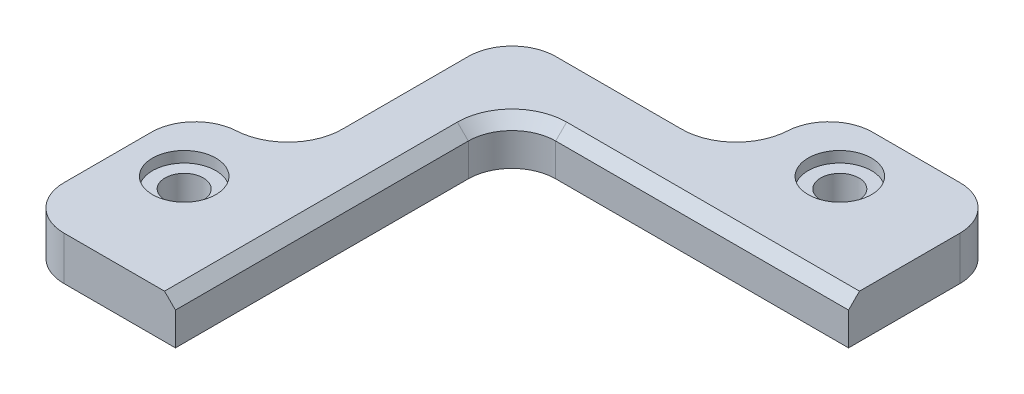
ISO-10303-21;
HEADER;
FILE_DESCRIPTION(('STEP AP214'),'2;1');
FILE_NAME('part.step','',(''),(''),'','','');
FILE_SCHEMA(('AUTOMOTIVE_DESIGN { 1 0 10303 214 1 1 1 1 }'));
ENDSEC;
DATA;
#1=APPLICATION_CONTEXT('core data for automotive mechanical design processes');
#2=APPLICATION_PROTOCOL_DEFINITION('international standard','automotive_design',2000,#1);
#3=PRODUCT_CONTEXT('',#1,'mechanical');
#4=PRODUCT('Part','Part','',(#3));
#5=PRODUCT_RELATED_PRODUCT_CATEGORY('part','',(#4));
#6=PRODUCT_DEFINITION_FORMATION('','',#4);
#7=PRODUCT_DEFINITION_CONTEXT('part definition',#1,'design');
#8=PRODUCT_DEFINITION('design','',#6,#7);
#9=PRODUCT_DEFINITION_SHAPE('','',#8);
#10=(LENGTH_UNIT() NAMED_UNIT(*) SI_UNIT(.MILLI.,.METRE.));
#11=(NAMED_UNIT(*) PLANE_ANGLE_UNIT() SI_UNIT($,.RADIAN.));
#12=(NAMED_UNIT(*) SI_UNIT($,.STERADIAN.) SOLID_ANGLE_UNIT());
#13=UNCERTAINTY_MEASURE_WITH_UNIT(LENGTH_MEASURE(1.E-05),#10,'distance_accuracy_value','');
#14=(GEOMETRIC_REPRESENTATION_CONTEXT(3) GLOBAL_UNCERTAINTY_ASSIGNED_CONTEXT((#13)) GLOBAL_UNIT_ASSIGNED_CONTEXT((#10,
#11,#12)) REPRESENTATION_CONTEXT('',''));
#15=CARTESIAN_POINT('',(0.,0.,0.));
#16=DIRECTION('',(0.,0.,1.));
#17=DIRECTION('',(1.,0.,0.));
#18=AXIS2_PLACEMENT_3D('',#15,#16,#17);
#19=CARTESIAN_POINT('',(35.,4.,-40.));
#20=DIRECTION('',(0.,-1.,0.));
#21=DIRECTION('',(0.,0.,-1.));
#22=AXIS2_PLACEMENT_3D('',#19,#20,#21);
#23=CYLINDRICAL_SURFACE('',#22,1.75);
#24=CARTESIAN_POINT('',(35.,0.,-40.));
#25=DIRECTION('',(0.,1.,0.));
#26=DIRECTION('',(0.,0.,1.));
#27=AXIS2_PLACEMENT_3D('',#24,#25,#26);
#28=CIRCLE('',#27,1.75);
#29=CARTESIAN_POINT('',(35.,0.,-38.25));
#30=VERTEX_POINT('',#29);
#31=EDGE_CURVE('E172',#30,#30,#28,.T.);
#32=ORIENTED_EDGE('',*,*,#31,.F.);
#33=EDGE_LOOP('',(#32));
#34=FACE_BOUND('',#33,.T.);
#35=CARTESIAN_POINT('',(35.,3.,-40.));
#36=DIRECTION('',(0.,1.,0.));
#37=DIRECTION('',(0.,0.,1.));
#38=AXIS2_PLACEMENT_3D('',#35,#36,#37);
#39=CIRCLE('',#38,1.75);
#40=CARTESIAN_POINT('',(35.,3.,-38.25));
#41=VERTEX_POINT('',#40);
#42=EDGE_CURVE('E288',#41,#41,#39,.T.);
#43=ORIENTED_EDGE('',*,*,#42,.T.);
#44=EDGE_LOOP('',(#43));
#45=FACE_BOUND('',#44,.T.);
#46=ADVANCED_FACE('F35',(#34,#45),#23,.F.);
#47=CARTESIAN_POINT('',(5.,4.,-9.99999999999999));
#48=DIRECTION('',(0.,-1.,0.));
#49=DIRECTION('',(0.,0.,-1.));
#50=AXIS2_PLACEMENT_3D('',#47,#48,#49);
#51=CYLINDRICAL_SURFACE('',#50,1.75);
#52=CARTESIAN_POINT('',(5.,0.,-9.99999999999999));
#53=DIRECTION('',(0.,1.,0.));
#54=DIRECTION('',(0.,0.,1.));
#55=AXIS2_PLACEMENT_3D('',#52,#53,#54);
#56=CIRCLE('',#55,1.75);
#57=CARTESIAN_POINT('',(5.,0.,-8.24999999999999));
#58=VERTEX_POINT('',#57);
#59=EDGE_CURVE('E198',#58,#58,#56,.T.);
#60=ORIENTED_EDGE('',*,*,#59,.F.);
#61=EDGE_LOOP('',(#60));
#62=FACE_BOUND('',#61,.T.);
#63=CARTESIAN_POINT('',(5.,3.,-9.99999999999999));
#64=DIRECTION('',(0.,1.,0.));
#65=DIRECTION('',(0.,0.,1.));
#66=AXIS2_PLACEMENT_3D('',#63,#64,#65);
#67=CIRCLE('',#66,1.75);
#68=CARTESIAN_POINT('',(5.,3.,-8.24999999999999));
#69=VERTEX_POINT('',#68);
#70=EDGE_CURVE('E291',#69,#69,#67,.T.);
#71=ORIENTED_EDGE('',*,*,#70,.T.);
#72=EDGE_LOOP('',(#71));
#73=FACE_BOUND('',#72,.T.);
#74=ADVANCED_FACE('F383',(#62,#73),#51,.F.);
#75=CARTESIAN_POINT('',(0.,4.,-45.));
#76=DIRECTION('',(0.,0.,1.));
#77=DIRECTION('',(1.,0.,0.));
#78=AXIS2_PLACEMENT_3D('',#75,#76,#77);
#79=PLANE('',#78);
#80=DIRECTION('',(-1.,0.,0.));
#81=VECTOR('',#80,1.);
#82=CARTESIAN_POINT('',(0.,0.,-45.));
#83=LINE('',#82,#81);
#84=CARTESIAN_POINT('',(41.,0.,-45.));
#85=VERTEX_POINT('',#84);
#86=CARTESIAN_POINT('',(33.,0.,-45.));
#87=VERTEX_POINT('',#86);
#88=EDGE_CURVE('E219',#85,#87,#83,.T.);
#89=ORIENTED_EDGE('',*,*,#88,.T.);
#90=DIRECTION('',(0.,1.,0.));
#91=VECTOR('',#90,1.);
#92=CARTESIAN_POINT('',(33.,4.,-45.));
#93=LINE('',#92,#91);
#94=CARTESIAN_POINT('',(33.,4.,-45.));
#95=VERTEX_POINT('',#94);
#96=EDGE_CURVE('E262',#87,#95,#93,.T.);
#97=ORIENTED_EDGE('',*,*,#96,.T.);
#98=DIRECTION('',(-1.,0.,0.));
#99=VECTOR('',#98,1.);
#100=CARTESIAN_POINT('',(0.,4.,-45.));
#101=LINE('',#100,#99);
#102=CARTESIAN_POINT('',(41.,4.,-45.));
#103=VERTEX_POINT('',#102);
#104=EDGE_CURVE('E210',#103,#95,#101,.T.);
#105=ORIENTED_EDGE('',*,*,#104,.F.);
#106=DIRECTION('',(0.,-1.,0.));
#107=VECTOR('',#106,1.);
#108=CARTESIAN_POINT('',(41.,4.,-45.));
#109=LINE('',#108,#107);
#110=EDGE_CURVE('E259',#103,#85,#109,.T.);
#111=ORIENTED_EDGE('',*,*,#110,.T.);
#112=EDGE_LOOP('',(#89,#97,#105,#111));
#113=FACE_BOUND('',#112,.T.);
#114=ADVANCED_FACE('F368',(#113),#79,.F.);
#115=CARTESIAN_POINT('',(0.,4.,0.));
#116=DIRECTION('',(0.,-1.,0.));
#117=DIRECTION('',(0.,0.,-1.));
#118=AXIS2_PLACEMENT_3D('',#115,#116,#117);
#119=PLANE('',#118);
#120=CARTESIAN_POINT('',(35.,4.,-40.));
#121=DIRECTION('',(0.,1.,0.));
#122=DIRECTION('',(0.,0.,1.));
#123=AXIS2_PLACEMENT_3D('',#120,#121,#122);
#124=CIRCLE('',#123,2.9);
#125=CARTESIAN_POINT('',(35.,4.,-37.1));
#126=VERTEX_POINT('',#125);
#127=EDGE_CURVE('E463',#126,#126,#124,.T.);
#128=ORIENTED_EDGE('',*,*,#127,.F.);
#129=EDGE_LOOP('',(#128));
#130=FACE_BOUND('',#129,.T.);
#131=CARTESIAN_POINT('',(5.,4.,-9.99999999999999));
#132=DIRECTION('',(0.,1.,0.));
#133=DIRECTION('',(0.,0.,1.));
#134=AXIS2_PLACEMENT_3D('',#131,#132,#133);
#135=CIRCLE('',#134,2.9);
#136=CARTESIAN_POINT('',(5.,4.,-7.1));
#137=VERTEX_POINT('',#136);
#138=EDGE_CURVE('E457',#137,#137,#135,.T.);
#139=ORIENTED_EDGE('',*,*,#138,.F.);
#140=EDGE_LOOP('',(#139));
#141=FACE_BOUND('',#140,.T.);
#142=DIRECTION('',(1.,0.,0.));
#143=VECTOR('',#142,1.);
#144=CARTESIAN_POINT('',(10.,4.,0.));
#145=LINE('',#144,#143);
#146=CARTESIAN_POINT('',(4.,4.,0.));
#147=VERTEX_POINT('',#146);
#148=CARTESIAN_POINT('',(13.2,4.,0.));
#149=VERTEX_POINT('',#148);
#150=EDGE_CURVE('E204',#147,#149,#145,.T.);
#151=ORIENTED_EDGE('',*,*,#150,.T.);
#152=DIRECTION('',(0.,0.,-1.));
#153=VECTOR('',#152,1.);
#154=CARTESIAN_POINT('',(13.2,4.,-26.8));
#155=LINE('',#154,#153);
#156=CARTESIAN_POINT('',(13.2,4.,-26.8));
#157=VERTEX_POINT('',#156);
#158=EDGE_CURVE('E272',#149,#157,#155,.T.);
#159=ORIENTED_EDGE('',*,*,#158,.T.);
#160=CARTESIAN_POINT('',(18.2,4.,-26.8));
#161=DIRECTION('',(0.,-1.,0.));
#162=DIRECTION('',(0.,0.,-1.));
#163=AXIS2_PLACEMENT_3D('',#160,#161,#162);
#164=CIRCLE('',#163,4.99999999999998);
#165=CARTESIAN_POINT('',(18.2,4.,-31.8));
#166=VERTEX_POINT('',#165);
#167=EDGE_CURVE('E270',#157,#166,#164,.T.);
#168=ORIENTED_EDGE('',*,*,#167,.T.);
#169=DIRECTION('',(1.,0.,0.));
#170=VECTOR('',#169,1.);
#171=CARTESIAN_POINT('',(0.,4.,-31.8));
#172=LINE('',#171,#170);
#173=CARTESIAN_POINT('',(45.,4.,-31.8));
#174=VERTEX_POINT('',#173);
#175=EDGE_CURVE('E268',#166,#174,#172,.T.);
#176=ORIENTED_EDGE('',*,*,#175,.T.);
#177=DIRECTION('',(0.,0.,-1.));
#178=VECTOR('',#177,1.);
#179=CARTESIAN_POINT('',(45.,4.,-45.));
#180=LINE('',#179,#178);
#181=CARTESIAN_POINT('',(45.,4.,-41.));
#182=VERTEX_POINT('',#181);
#183=EDGE_CURVE('E207',#174,#182,#180,.T.);
#184=ORIENTED_EDGE('',*,*,#183,.T.);
#185=CARTESIAN_POINT('',(41.,4.,-41.));
#186=DIRECTION('',(0.,-1.,0.));
#187=DIRECTION('',(0.,0.,-1.));
#188=AXIS2_PLACEMENT_3D('',#185,#186,#187);
#189=CIRCLE('',#188,4.);
#190=EDGE_CURVE('E251',#182,#103,#189,.F.);
#191=ORIENTED_EDGE('',*,*,#190,.T.);
#192=ORIENTED_EDGE('',*,*,#104,.T.);
#193=CARTESIAN_POINT('',(33.,4.,-41.));
#194=DIRECTION('',(0.,-1.,0.));
#195=DIRECTION('',(0.,0.,-1.));
#196=AXIS2_PLACEMENT_3D('',#193,#194,#195);
#197=CIRCLE('',#196,4.);
#198=CARTESIAN_POINT('',(29.0061776098641,4.,-41.2222222222222));
#199=VERTEX_POINT('',#198);
#200=EDGE_CURVE('E253',#95,#199,#197,.F.);
#201=ORIENTED_EDGE('',*,*,#200,.T.);
#202=CARTESIAN_POINT('',(24.0138996221943,4.,-41.5));
#203=DIRECTION('',(0.,-1.,0.));
#204=DIRECTION('',(0.,0.,-1.));
#205=AXIS2_PLACEMENT_3D('',#202,#203,#204);
#206=CIRCLE('',#205,5.);
#207=CARTESIAN_POINT('',(24.0138996221943,4.,-36.5));
#208=VERTEX_POINT('',#207);
#209=EDGE_CURVE('E43',#199,#208,#206,.T.);
#210=ORIENTED_EDGE('',*,*,#209,.T.);
#211=DIRECTION('',(1.,0.,0.));
#212=VECTOR('',#211,1.);
#213=CARTESIAN_POINT('',(0.,4.,-36.5));
#214=LINE('',#213,#212);
#215=CARTESIAN_POINT('',(12.5,4.,-36.5));
#216=VERTEX_POINT('',#215);
#217=EDGE_CURVE('E322',#216,#208,#214,.T.);
#218=ORIENTED_EDGE('',*,*,#217,.F.);
#219=CARTESIAN_POINT('',(12.5,4.,-32.5));
#220=DIRECTION('',(0.,-1.,0.));
#221=DIRECTION('',(0.,0.,-1.));
#222=AXIS2_PLACEMENT_3D('',#219,#220,#221);
#223=CIRCLE('',#222,4.);
#224=CARTESIAN_POINT('',(8.5,4.,-32.5));
#225=VERTEX_POINT('',#224);
#226=EDGE_CURVE('E230',#216,#225,#223,.F.);
#227=ORIENTED_EDGE('',*,*,#226,.T.);
#228=DIRECTION('',(0.,0.,1.));
#229=VECTOR('',#228,1.);
#230=CARTESIAN_POINT('',(8.50000000000001,4.,0.));
#231=LINE('',#230,#229);
#232=CARTESIAN_POINT('',(8.5,4.,-20.9861003778057));
#233=VERTEX_POINT('',#232);
#234=EDGE_CURVE('E327',#225,#233,#231,.T.);
#235=ORIENTED_EDGE('',*,*,#234,.T.);
#236=CARTESIAN_POINT('',(3.5,4.,-20.9861003778057));
#237=DIRECTION('',(0.,-1.,0.));
#238=DIRECTION('',(0.,0.,-1.));
#239=AXIS2_PLACEMENT_3D('',#236,#237,#238);
#240=CIRCLE('',#239,5.);
#241=CARTESIAN_POINT('',(3.77777777777778,4.,-15.9938223901359));
#242=VERTEX_POINT('',#241);
#243=EDGE_CURVE('E305',#233,#242,#240,.T.);
#244=ORIENTED_EDGE('',*,*,#243,.T.);
#245=CARTESIAN_POINT('',(4.,4.,-12.));
#246=DIRECTION('',(0.,-1.,0.));
#247=DIRECTION('',(0.,0.,-1.));
#248=AXIS2_PLACEMENT_3D('',#245,#246,#247);
#249=CIRCLE('',#248,4.);
#250=CARTESIAN_POINT('',(0.,4.,-12.));
#251=VERTEX_POINT('',#250);
#252=EDGE_CURVE('E255',#242,#251,#249,.F.);
#253=ORIENTED_EDGE('',*,*,#252,.T.);
#254=DIRECTION('',(0.,0.,1.));
#255=VECTOR('',#254,1.);
#256=CARTESIAN_POINT('',(0.,4.,0.));
#257=LINE('',#256,#255);
#258=CARTESIAN_POINT('',(0.,4.,-4.));
#259=VERTEX_POINT('',#258);
#260=EDGE_CURVE('E213',#251,#259,#257,.T.);
#261=ORIENTED_EDGE('',*,*,#260,.T.);
#262=CARTESIAN_POINT('',(4.,4.,-4.));
#263=DIRECTION('',(0.,-1.,0.));
#264=DIRECTION('',(0.,0.,-1.));
#265=AXIS2_PLACEMENT_3D('',#262,#263,#264);
#266=CIRCLE('',#265,4.);
#267=EDGE_CURVE('E257',#259,#147,#266,.F.);
#268=ORIENTED_EDGE('',*,*,#267,.T.);
#269=EDGE_LOOP('',(#151,#159,#168,#176,#184,#191,#192,#201,#210,#218,#227,#235,#244,#253,#261,#268));
#270=FACE_BOUND('',#269,.T.);
#271=ADVANCED_FACE('F325',(#130,#141,#270),#119,.F.);
#272=CARTESIAN_POINT('',(0.,0.,0.));
#273=DIRECTION('',(0.,-1.,0.));
#274=DIRECTION('',(0.,0.,-1.));
#275=AXIS2_PLACEMENT_3D('',#272,#273,#274);
#276=PLANE('',#275);
#277=DIRECTION('',(1.,0.,0.));
#278=VECTOR('',#277,1.);
#279=CARTESIAN_POINT('',(10.,0.,0.));
#280=LINE('',#279,#278);
#281=CARTESIAN_POINT('',(4.,0.,0.));
#282=VERTEX_POINT('',#281);
#283=CARTESIAN_POINT('',(14.2,0.,0.));
#284=VERTEX_POINT('',#283);
#285=EDGE_CURVE('E161',#282,#284,#280,.T.);
#286=ORIENTED_EDGE('',*,*,#285,.F.);
#287=CARTESIAN_POINT('',(4.,0.,-4.));
#288=DIRECTION('',(0.,-1.,0.));
#289=DIRECTION('',(0.,0.,-1.));
#290=AXIS2_PLACEMENT_3D('',#287,#288,#289);
#291=CIRCLE('',#290,4.);
#292=CARTESIAN_POINT('',(0.,0.,-4.));
#293=VERTEX_POINT('',#292);
#294=EDGE_CURVE('E245',#282,#293,#291,.T.);
#295=ORIENTED_EDGE('',*,*,#294,.T.);
#296=DIRECTION('',(0.,0.,1.));
#297=VECTOR('',#296,1.);
#298=CARTESIAN_POINT('',(0.,0.,0.));
#299=LINE('',#298,#297);
#300=CARTESIAN_POINT('',(0.,0.,-12.));
#301=VERTEX_POINT('',#300);
#302=EDGE_CURVE('E208',#301,#293,#299,.T.);
#303=ORIENTED_EDGE('',*,*,#302,.F.);
#304=CARTESIAN_POINT('',(4.,0.,-12.));
#305=DIRECTION('',(0.,-1.,0.));
#306=DIRECTION('',(0.,0.,-1.));
#307=AXIS2_PLACEMENT_3D('',#304,#305,#306);
#308=CIRCLE('',#307,4.);
#309=CARTESIAN_POINT('',(3.77777777777778,0.,-15.9938223901359));
#310=VERTEX_POINT('',#309);
#311=EDGE_CURVE('E242',#301,#310,#308,.T.);
#312=ORIENTED_EDGE('',*,*,#311,.T.);
#313=CARTESIAN_POINT('',(3.5,0.,-20.9861003778057));
#314=DIRECTION('',(0.,-1.,0.));
#315=DIRECTION('',(0.,0.,-1.));
#316=AXIS2_PLACEMENT_3D('',#313,#314,#315);
#317=CIRCLE('',#316,5.);
#318=CARTESIAN_POINT('',(8.5,0.,-20.9861003778057));
#319=VERTEX_POINT('',#318);
#320=EDGE_CURVE('E307',#310,#319,#317,.F.);
#321=ORIENTED_EDGE('',*,*,#320,.T.);
#322=DIRECTION('',(0.,0.,1.));
#323=VECTOR('',#322,1.);
#324=CARTESIAN_POINT('',(8.50000000000001,0.,0.));
#325=LINE('',#324,#323);
#326=CARTESIAN_POINT('',(8.5,0.,-32.5));
#327=VERTEX_POINT('',#326);
#328=EDGE_CURVE('E196',#327,#319,#325,.T.);
#329=ORIENTED_EDGE('',*,*,#328,.F.);
#330=CARTESIAN_POINT('',(12.5,0.,-32.5));
#331=DIRECTION('',(0.,-1.,0.));
#332=DIRECTION('',(0.,0.,-1.));
#333=AXIS2_PLACEMENT_3D('',#330,#331,#332);
#334=CIRCLE('',#333,4.);
#335=CARTESIAN_POINT('',(12.5,0.,-36.5));
#336=VERTEX_POINT('',#335);
#337=EDGE_CURVE('E234',#327,#336,#334,.T.);
#338=ORIENTED_EDGE('',*,*,#337,.T.);
#339=DIRECTION('',(1.,0.,0.));
#340=VECTOR('',#339,1.);
#341=CARTESIAN_POINT('',(0.,0.,-36.5));
#342=LINE('',#341,#340);
#343=CARTESIAN_POINT('',(24.0138996221943,0.,-36.5));
#344=VERTEX_POINT('',#343);
#345=EDGE_CURVE('E192',#336,#344,#342,.T.);
#346=ORIENTED_EDGE('',*,*,#345,.T.);
#347=CARTESIAN_POINT('',(24.0138996221943,0.,-41.5));
#348=DIRECTION('',(0.,-1.,0.));
#349=DIRECTION('',(0.,0.,-1.));
#350=AXIS2_PLACEMENT_3D('',#347,#348,#349);
#351=CIRCLE('',#350,5.);
#352=CARTESIAN_POINT('',(29.0061776098641,0.,-41.2222222222222));
#353=VERTEX_POINT('',#352);
#354=EDGE_CURVE('E11',#344,#353,#351,.F.);
#355=ORIENTED_EDGE('',*,*,#354,.T.);
#356=CARTESIAN_POINT('',(33.,0.,-41.));
#357=DIRECTION('',(0.,-1.,0.));
#358=DIRECTION('',(0.,0.,-1.));
#359=AXIS2_PLACEMENT_3D('',#356,#357,#358);
#360=CIRCLE('',#359,4.);
#361=EDGE_CURVE('E240',#353,#87,#360,.T.);
#362=ORIENTED_EDGE('',*,*,#361,.T.);
#363=ORIENTED_EDGE('',*,*,#88,.F.);
#364=CARTESIAN_POINT('',(41.,0.,-41.));
#365=DIRECTION('',(0.,-1.,0.));
#366=DIRECTION('',(0.,0.,-1.));
#367=AXIS2_PLACEMENT_3D('',#364,#365,#366);
#368=CIRCLE('',#367,4.);
#369=CARTESIAN_POINT('',(45.,0.,-41.));
#370=VERTEX_POINT('',#369);
#371=EDGE_CURVE('E238',#85,#370,#368,.T.);
#372=ORIENTED_EDGE('',*,*,#371,.T.);
#373=DIRECTION('',(0.,0.,-1.));
#374=VECTOR('',#373,1.);
#375=CARTESIAN_POINT('',(45.,0.,-45.));
#376=LINE('',#375,#374);
#377=CARTESIAN_POINT('',(45.,0.,-30.8));
#378=VERTEX_POINT('',#377);
#379=EDGE_CURVE('E171',#378,#370,#376,.T.);
#380=ORIENTED_EDGE('',*,*,#379,.F.);
#381=DIRECTION('',(-1.,0.,0.));
#382=VECTOR('',#381,1.);
#383=CARTESIAN_POINT('',(0.,0.,-30.8));
#384=LINE('',#383,#382);
#385=CARTESIAN_POINT('',(18.2,0.,-30.8));
#386=VERTEX_POINT('',#385);
#387=EDGE_CURVE('E182',#378,#386,#384,.T.);
#388=ORIENTED_EDGE('',*,*,#387,.T.);
#389=CARTESIAN_POINT('',(18.2,0.,-26.8));
#390=DIRECTION('',(0.,-1.,0.));
#391=DIRECTION('',(0.,0.,-1.));
#392=AXIS2_PLACEMENT_3D('',#389,#390,#391);
#393=CIRCLE('',#392,4.);
#394=CARTESIAN_POINT('',(14.2,0.,-26.8));
#395=VERTEX_POINT('',#394);
#396=EDGE_CURVE('E188',#386,#395,#393,.F.);
#397=ORIENTED_EDGE('',*,*,#396,.T.);
#398=DIRECTION('',(0.,0.,-1.));
#399=VECTOR('',#398,1.);
#400=CARTESIAN_POINT('',(14.2,0.,0.));
#401=LINE('',#400,#399);
#402=EDGE_CURVE('E178',#284,#395,#401,.T.);
#403=ORIENTED_EDGE('',*,*,#402,.F.);
#404=EDGE_LOOP('',(#286,#295,#303,#312,#321,#329,#338,#346,#355,#362,#363,#372,#380,#388,#397,#403));
#405=FACE_BOUND('',#404,.T.);
#406=ORIENTED_EDGE('',*,*,#31,.T.);
#407=EDGE_LOOP('',(#406));
#408=FACE_BOUND('',#407,.T.);
#409=ORIENTED_EDGE('',*,*,#59,.T.);
#410=EDGE_LOOP('',(#409));
#411=FACE_BOUND('',#410,.T.);
#412=ADVANCED_FACE('F184',(#405,#408,#411),#276,.T.);
#413=CARTESIAN_POINT('',(10.,4.,0.));
#414=DIRECTION('',(0.,0.,-1.));
#415=DIRECTION('',(-1.,0.,0.));
#416=AXIS2_PLACEMENT_3D('',#413,#414,#415);
#417=PLANE('',#416);
#418=DIRECTION('',(0.,1.,0.));
#419=VECTOR('',#418,1.);
#420=CARTESIAN_POINT('',(14.2,-49.4974746830583,0.));
#421=LINE('',#420,#419);
#422=CARTESIAN_POINT('',(14.2,3.00000000000002,0.));
#423=VERTEX_POINT('',#422);
#424=EDGE_CURVE('E164',#284,#423,#421,.T.);
#425=ORIENTED_EDGE('',*,*,#424,.T.);
#426=DIRECTION('',(-0.707106781186549,0.707106781186546,0.));
#427=VECTOR('',#426,1.);
#428=CARTESIAN_POINT('',(13.2,4.,0.));
#429=LINE('',#428,#427);
#430=EDGE_CURVE('E276',#423,#149,#429,.T.);
#431=ORIENTED_EDGE('',*,*,#430,.T.);
#432=ORIENTED_EDGE('',*,*,#150,.F.);
#433=DIRECTION('',(0.,-1.,0.));
#434=VECTOR('',#433,1.);
#435=CARTESIAN_POINT('',(4.,4.,0.));
#436=LINE('',#435,#434);
#437=EDGE_CURVE('E168',#147,#282,#436,.T.);
#438=ORIENTED_EDGE('',*,*,#437,.T.);
#439=ORIENTED_EDGE('',*,*,#285,.T.);
#440=EDGE_LOOP('',(#425,#431,#432,#438,#439));
#441=FACE_BOUND('',#440,.T.);
#442=ADVANCED_FACE('F163',(#441),#417,.F.);
#443=CARTESIAN_POINT('',(45.,4.,-45.));
#444=DIRECTION('',(-1.,0.,0.));
#445=DIRECTION('',(0.,0.,1.));
#446=AXIS2_PLACEMENT_3D('',#443,#444,#445);
#447=PLANE('',#446);
#448=ORIENTED_EDGE('',*,*,#183,.F.);
#449=DIRECTION('',(0.,0.707106781186545,-0.70710678118655));
#450=VECTOR('',#449,1.);
#451=CARTESIAN_POINT('',(45.,3.00000000000001,-30.8));
#452=LINE('',#451,#450);
#453=CARTESIAN_POINT('',(45.,3.00000000000002,-30.8));
#454=VERTEX_POINT('',#453);
#455=EDGE_CURVE('E282',#174,#454,#452,.F.);
#456=ORIENTED_EDGE('',*,*,#455,.T.);
#457=DIRECTION('',(0.,1.,0.));
#458=VECTOR('',#457,1.);
#459=CARTESIAN_POINT('',(45.,-49.4974746830583,-30.8));
#460=LINE('',#459,#458);
#461=EDGE_CURVE('E189',#378,#454,#460,.T.);
#462=ORIENTED_EDGE('',*,*,#461,.F.);
#463=ORIENTED_EDGE('',*,*,#379,.T.);
#464=DIRECTION('',(0.,-1.,0.));
#465=VECTOR('',#464,1.);
#466=CARTESIAN_POINT('',(45.,4.,-41.));
#467=LINE('',#466,#465);
#468=EDGE_CURVE('E265',#370,#182,#467,.F.);
#469=ORIENTED_EDGE('',*,*,#468,.T.);
#470=EDGE_LOOP('',(#448,#456,#462,#463,#469));
#471=FACE_BOUND('',#470,.T.);
#472=ADVANCED_FACE('F362',(#471),#447,.F.);
#473=CARTESIAN_POINT('',(0.,4.,0.));
#474=DIRECTION('',(1.,0.,0.));
#475=DIRECTION('',(0.,0.,-1.));
#476=AXIS2_PLACEMENT_3D('',#473,#474,#475);
#477=PLANE('',#476);
#478=ORIENTED_EDGE('',*,*,#302,.T.);
#479=DIRECTION('',(0.,-1.,0.));
#480=VECTOR('',#479,1.);
#481=CARTESIAN_POINT('',(0.,4.,-4.));
#482=LINE('',#481,#480);
#483=EDGE_CURVE('E249',#293,#259,#482,.F.);
#484=ORIENTED_EDGE('',*,*,#483,.T.);
#485=ORIENTED_EDGE('',*,*,#260,.F.);
#486=DIRECTION('',(0.,1.,0.));
#487=VECTOR('',#486,1.);
#488=CARTESIAN_POINT('',(0.,4.,-12.));
#489=LINE('',#488,#487);
#490=EDGE_CURVE('E247',#251,#301,#489,.F.);
#491=ORIENTED_EDGE('',*,*,#490,.T.);
#492=EDGE_LOOP('',(#478,#484,#485,#491));
#493=FACE_BOUND('',#492,.T.);
#494=ADVANCED_FACE('F332',(#493),#477,.F.);
#495=CARTESIAN_POINT('',(0.,-49.4974746830583,-30.8));
#496=DIRECTION('',(0.,0.,-1.));
#497=DIRECTION('',(-1.,0.,0.));
#498=AXIS2_PLACEMENT_3D('',#495,#496,#497);
#499=PLANE('',#498);
#500=ORIENTED_EDGE('',*,*,#461,.T.);
#501=DIRECTION('',(-1.,0.,0.));
#502=VECTOR('',#501,1.);
#503=CARTESIAN_POINT('',(0.,3.00000000000002,-30.8));
#504=LINE('',#503,#502);
#505=CARTESIAN_POINT('',(18.2,3.00000000000002,-30.8));
#506=VERTEX_POINT('',#505);
#507=EDGE_CURVE('E280',#454,#506,#504,.T.);
#508=ORIENTED_EDGE('',*,*,#507,.T.);
#509=DIRECTION('',(0.,1.,0.));
#510=VECTOR('',#509,1.);
#511=CARTESIAN_POINT('',(18.2,-49.4974746830583,-30.8));
#512=LINE('',#511,#510);
#513=EDGE_CURVE('E225',#506,#386,#512,.F.);
#514=ORIENTED_EDGE('',*,*,#513,.T.);
#515=ORIENTED_EDGE('',*,*,#387,.F.);
#516=EDGE_LOOP('',(#500,#508,#514,#515));
#517=FACE_BOUND('',#516,.T.);
#518=ADVANCED_FACE('F357',(#517),#499,.F.);
#519=CARTESIAN_POINT('',(14.2,-49.4974746830583,0.));
#520=DIRECTION('',(1.,0.,0.));
#521=DIRECTION('',(0.,0.,-1.));
#522=AXIS2_PLACEMENT_3D('',#519,#520,#521);
#523=PLANE('',#522);
#524=DIRECTION('',(0.,1.,0.));
#525=VECTOR('',#524,1.);
#526=CARTESIAN_POINT('',(14.2,-49.4974746830583,-26.8));
#527=LINE('',#526,#525);
#528=CARTESIAN_POINT('',(14.2,3.00000000000002,-26.8));
#529=VERTEX_POINT('',#528);
#530=EDGE_CURVE('E215',#395,#529,#527,.T.);
#531=ORIENTED_EDGE('',*,*,#530,.T.);
#532=DIRECTION('',(0.,0.,1.));
#533=VECTOR('',#532,1.);
#534=CARTESIAN_POINT('',(14.2,3.00000000000002,0.));
#535=LINE('',#534,#533);
#536=EDGE_CURVE('E181',#529,#423,#535,.T.);
#537=ORIENTED_EDGE('',*,*,#536,.T.);
#538=ORIENTED_EDGE('',*,*,#424,.F.);
#539=ORIENTED_EDGE('',*,*,#402,.T.);
#540=EDGE_LOOP('',(#531,#537,#538,#539));
#541=FACE_BOUND('',#540,.T.);
#542=ADVANCED_FACE('F177',(#541),#523,.T.);
#543=CARTESIAN_POINT('',(8.50000000000001,-41.0121933088198,0.));
#544=DIRECTION('',(-1.,0.,0.));
#545=DIRECTION('',(0.,0.,1.));
#546=AXIS2_PLACEMENT_3D('',#543,#544,#545);
#547=PLANE('',#546);
#548=ORIENTED_EDGE('',*,*,#328,.T.);
#549=DIRECTION('',(0.,-1.,0.));
#550=VECTOR('',#549,1.);
#551=CARTESIAN_POINT('',(8.5,4.,-20.9861003778057));
#552=LINE('',#551,#550);
#553=EDGE_CURVE('E284',#319,#233,#552,.F.);
#554=ORIENTED_EDGE('',*,*,#553,.T.);
#555=ORIENTED_EDGE('',*,*,#234,.F.);
#556=DIRECTION('',(0.,1.,0.));
#557=VECTOR('',#556,1.);
#558=CARTESIAN_POINT('',(8.5,0.,-32.5));
#559=LINE('',#558,#557);
#560=EDGE_CURVE('E232',#225,#327,#559,.F.);
#561=ORIENTED_EDGE('',*,*,#560,.T.);
#562=EDGE_LOOP('',(#548,#554,#555,#561));
#563=FACE_BOUND('',#562,.T.);
#564=ADVANCED_FACE('F318',(#563),#547,.T.);
#565=CARTESIAN_POINT('',(0.,-41.0121933088198,-36.5));
#566=DIRECTION('',(0.,0.,1.));
#567=DIRECTION('',(1.,0.,0.));
#568=AXIS2_PLACEMENT_3D('',#565,#566,#567);
#569=PLANE('',#568);
#570=ORIENTED_EDGE('',*,*,#217,.T.);
#571=DIRECTION('',(0.,-1.,0.));
#572=VECTOR('',#571,1.);
#573=CARTESIAN_POINT('',(24.0138996221943,-41.0121933088198,-36.5));
#574=LINE('',#573,#572);
#575=EDGE_CURVE('E56',#208,#344,#574,.T.);
#576=ORIENTED_EDGE('',*,*,#575,.T.);
#577=ORIENTED_EDGE('',*,*,#345,.F.);
#578=DIRECTION('',(0.,1.,0.));
#579=VECTOR('',#578,1.);
#580=CARTESIAN_POINT('',(12.5,4.,-36.5));
#581=LINE('',#580,#579);
#582=EDGE_CURVE('E227',#336,#216,#581,.T.);
#583=ORIENTED_EDGE('',*,*,#582,.T.);
#584=EDGE_LOOP('',(#570,#576,#577,#583));
#585=FACE_BOUND('',#584,.T.);
#586=ADVANCED_FACE('F411',(#585),#569,.F.);
#587=CARTESIAN_POINT('',(18.2,-49.4974746830583,-26.8));
#588=DIRECTION('',(0.,1.,0.));
#589=DIRECTION('',(0.,0.,1.));
#590=AXIS2_PLACEMENT_3D('',#587,#588,#589);
#591=CYLINDRICAL_SURFACE('',#590,4.);
#592=ORIENTED_EDGE('',*,*,#513,.F.);
#593=CARTESIAN_POINT('',(18.2,3.00000000000002,-26.8));
#594=DIRECTION('',(0.,-1.,0.));
#595=DIRECTION('',(0.,0.,-1.));
#596=AXIS2_PLACEMENT_3D('',#593,#594,#595);
#597=CIRCLE('',#596,4.);
#598=EDGE_CURVE('E278',#506,#529,#597,.F.);
#599=ORIENTED_EDGE('',*,*,#598,.T.);
#600=ORIENTED_EDGE('',*,*,#530,.F.);
#601=ORIENTED_EDGE('',*,*,#396,.F.);
#602=EDGE_LOOP('',(#592,#599,#600,#601));
#603=FACE_BOUND('',#602,.T.);
#604=ADVANCED_FACE('F354',(#603),#591,.F.);
#605=CARTESIAN_POINT('',(12.5,-41.0121933088198,-32.5));
#606=DIRECTION('',(0.,-1.,0.));
#607=DIRECTION('',(0.,0.,-1.));
#608=AXIS2_PLACEMENT_3D('',#605,#606,#607);
#609=CYLINDRICAL_SURFACE('',#608,4.);
#610=ORIENTED_EDGE('',*,*,#337,.F.);
#611=ORIENTED_EDGE('',*,*,#560,.F.);
#612=ORIENTED_EDGE('',*,*,#226,.F.);
#613=ORIENTED_EDGE('',*,*,#582,.F.);
#614=EDGE_LOOP('',(#610,#611,#612,#613));
#615=FACE_BOUND('',#614,.T.);
#616=ADVANCED_FACE('F410',(#615),#609,.T.);
#617=CARTESIAN_POINT('',(4.,4.,-4.));
#618=DIRECTION('',(0.,-1.,0.));
#619=DIRECTION('',(0.,0.,-1.));
#620=AXIS2_PLACEMENT_3D('',#617,#618,#619);
#621=CYLINDRICAL_SURFACE('',#620,4.);
#622=ORIENTED_EDGE('',*,*,#267,.F.);
#623=ORIENTED_EDGE('',*,*,#483,.F.);
#624=ORIENTED_EDGE('',*,*,#294,.F.);
#625=ORIENTED_EDGE('',*,*,#437,.F.);
#626=EDGE_LOOP('',(#622,#623,#624,#625));
#627=FACE_BOUND('',#626,.T.);
#628=ADVANCED_FACE('F336',(#627),#621,.T.);
#629=CARTESIAN_POINT('',(4.,-41.0121933088198,-12.));
#630=DIRECTION('',(0.,1.,0.));
#631=DIRECTION('',(0.,0.,1.));
#632=AXIS2_PLACEMENT_3D('',#629,#630,#631);
#633=CYLINDRICAL_SURFACE('',#632,4.);
#634=ORIENTED_EDGE('',*,*,#252,.F.);
#635=DIRECTION('',(0.,1.,0.));
#636=VECTOR('',#635,1.);
#637=CARTESIAN_POINT('',(3.77777777777778,-41.0121933088198,-15.9938223901359));
#638=LINE('',#637,#636);
#639=EDGE_CURVE('E299',#242,#310,#638,.F.);
#640=ORIENTED_EDGE('',*,*,#639,.T.);
#641=ORIENTED_EDGE('',*,*,#311,.F.);
#642=ORIENTED_EDGE('',*,*,#490,.F.);
#643=EDGE_LOOP('',(#634,#640,#641,#642));
#644=FACE_BOUND('',#643,.T.);
#645=ADVANCED_FACE('F330',(#644),#633,.T.);
#646=CARTESIAN_POINT('',(33.,4.,-41.));
#647=DIRECTION('',(0.,-1.,0.));
#648=DIRECTION('',(0.,0.,-1.));
#649=AXIS2_PLACEMENT_3D('',#646,#647,#648);
#650=CYLINDRICAL_SURFACE('',#649,4.);
#651=ORIENTED_EDGE('',*,*,#361,.F.);
#652=DIRECTION('',(0.,-1.,0.));
#653=VECTOR('',#652,1.);
#654=CARTESIAN_POINT('',(29.0061776098641,4.,-41.2222222222222));
#655=LINE('',#654,#653);
#656=EDGE_CURVE('E301',#353,#199,#655,.F.);
#657=ORIENTED_EDGE('',*,*,#656,.T.);
#658=ORIENTED_EDGE('',*,*,#200,.F.);
#659=ORIENTED_EDGE('',*,*,#96,.F.);
#660=EDGE_LOOP('',(#651,#657,#658,#659));
#661=FACE_BOUND('',#660,.T.);
#662=ADVANCED_FACE('F372',(#661),#650,.T.);
#663=CARTESIAN_POINT('',(41.,4.,-41.));
#664=DIRECTION('',(0.,-1.,0.));
#665=DIRECTION('',(0.,0.,-1.));
#666=AXIS2_PLACEMENT_3D('',#663,#664,#665);
#667=CYLINDRICAL_SURFACE('',#666,4.);
#668=ORIENTED_EDGE('',*,*,#190,.F.);
#669=ORIENTED_EDGE('',*,*,#468,.F.);
#670=ORIENTED_EDGE('',*,*,#371,.F.);
#671=ORIENTED_EDGE('',*,*,#110,.F.);
#672=EDGE_LOOP('',(#668,#669,#670,#671));
#673=FACE_BOUND('',#672,.T.);
#674=ADVANCED_FACE('F370',(#673),#667,.T.);
#675=CARTESIAN_POINT('',(0.,3.00000000000002,-30.8));
#676=DIRECTION('',(0.,-0.70710678118655,-0.707106781186545));
#677=DIRECTION('',(-1.,0.,0.));
#678=AXIS2_PLACEMENT_3D('',#675,#676,#677);
#679=PLANE('',#678);
#680=ORIENTED_EDGE('',*,*,#455,.F.);
#681=ORIENTED_EDGE('',*,*,#175,.F.);
#682=DIRECTION('',(0.,0.707106781186544,-0.707106781186551));
#683=VECTOR('',#682,1.);
#684=CARTESIAN_POINT('',(18.2,3.00000000000002,-30.8));
#685=LINE('',#684,#683);
#686=EDGE_CURVE('E287',#506,#166,#685,.T.);
#687=ORIENTED_EDGE('',*,*,#686,.F.);
#688=ORIENTED_EDGE('',*,*,#507,.F.);
#689=EDGE_LOOP('',(#680,#681,#687,#688));
#690=FACE_BOUND('',#689,.T.);
#691=ADVANCED_FACE('F348',(#690),#679,.F.);
#692=CARTESIAN_POINT('',(18.2,4.,-26.8));
#693=DIRECTION('',(0.,1.,0.));
#694=DIRECTION('',(0.,0.,1.));
#695=AXIS2_PLACEMENT_3D('',#692,#693,#694);
#696=CONICAL_SURFACE('',#695,4.99999999999999,0.785398163397448);
#697=ORIENTED_EDGE('',*,*,#686,.T.);
#698=ORIENTED_EDGE('',*,*,#167,.F.);
#699=DIRECTION('',(-0.707106781186546,0.707106781186549,0.));
#700=VECTOR('',#699,1.);
#701=CARTESIAN_POINT('',(14.2,3.00000000000002,-26.8));
#702=LINE('',#701,#700);
#703=EDGE_CURVE('E285',#529,#157,#702,.T.);
#704=ORIENTED_EDGE('',*,*,#703,.F.);
#705=ORIENTED_EDGE('',*,*,#598,.F.);
#706=EDGE_LOOP('',(#697,#698,#704,#705));
#707=FACE_BOUND('',#706,.T.);
#708=ADVANCED_FACE('F351',(#707),#696,.F.);
#709=CARTESIAN_POINT('',(13.2,4.,0.));
#710=DIRECTION('',(0.707106781186546,0.707106781186549,0.));
#711=DIRECTION('',(0.,0.,1.));
#712=AXIS2_PLACEMENT_3D('',#709,#710,#711);
#713=PLANE('',#712);
#714=ORIENTED_EDGE('',*,*,#430,.F.);
#715=ORIENTED_EDGE('',*,*,#536,.F.);
#716=ORIENTED_EDGE('',*,*,#703,.T.);
#717=ORIENTED_EDGE('',*,*,#158,.F.);
#718=EDGE_LOOP('',(#714,#715,#716,#717));
#719=FACE_BOUND('',#718,.T.);
#720=ADVANCED_FACE('F339',(#719),#713,.T.);
#721=CARTESIAN_POINT('',(5.,3.,-9.99999999999999));
#722=DIRECTION('',(0.,1.,0.));
#723=DIRECTION('',(0.,0.,1.));
#724=AXIS2_PLACEMENT_3D('',#721,#722,#723);
#725=CYLINDRICAL_SURFACE('',#724,2.9);
#726=CARTESIAN_POINT('',(5.,3.,-9.99999999999999));
#727=DIRECTION('',(0.,1.,0.));
#728=DIRECTION('',(0.,0.,1.));
#729=AXIS2_PLACEMENT_3D('',#726,#727,#728);
#730=CIRCLE('',#729,2.9);
#731=CARTESIAN_POINT('',(5.,3.,-7.1));
#732=VERTEX_POINT('',#731);
#733=EDGE_CURVE('E460',#732,#732,#730,.T.);
#734=ORIENTED_EDGE('',*,*,#733,.F.);
#735=EDGE_LOOP('',(#734));
#736=FACE_BOUND('',#735,.T.);
#737=ORIENTED_EDGE('',*,*,#138,.T.);
#738=EDGE_LOOP('',(#737));
#739=FACE_BOUND('',#738,.T.);
#740=ADVANCED_FACE('F479',(#736,#739),#725,.F.);
#741=CARTESIAN_POINT('',(5.,3.,-9.99999999999999));
#742=DIRECTION('',(0.,1.,0.));
#743=DIRECTION('',(0.,0.,1.));
#744=AXIS2_PLACEMENT_3D('',#741,#742,#743);
#745=PLANE('',#744);
#746=ORIENTED_EDGE('',*,*,#70,.F.);
#747=EDGE_LOOP('',(#746));
#748=FACE_BOUND('',#747,.T.);
#749=ORIENTED_EDGE('',*,*,#733,.T.);
#750=EDGE_LOOP('',(#749));
#751=FACE_BOUND('',#750,.T.);
#752=ADVANCED_FACE('F473',(#748,#751),#745,.T.);
#753=CARTESIAN_POINT('',(35.,3.,-40.));
#754=DIRECTION('',(0.,1.,0.));
#755=DIRECTION('',(0.,0.,1.));
#756=AXIS2_PLACEMENT_3D('',#753,#754,#755);
#757=CYLINDRICAL_SURFACE('',#756,2.9);
#758=CARTESIAN_POINT('',(35.,3.,-40.));
#759=DIRECTION('',(0.,1.,0.));
#760=DIRECTION('',(0.,0.,1.));
#761=AXIS2_PLACEMENT_3D('',#758,#759,#760);
#762=CIRCLE('',#761,2.9);
#763=CARTESIAN_POINT('',(35.,3.,-37.1));
#764=VERTEX_POINT('',#763);
#765=EDGE_CURVE('E294',#764,#764,#762,.T.);
#766=ORIENTED_EDGE('',*,*,#765,.F.);
#767=EDGE_LOOP('',(#766));
#768=FACE_BOUND('',#767,.T.);
#769=ORIENTED_EDGE('',*,*,#127,.T.);
#770=EDGE_LOOP('',(#769));
#771=FACE_BOUND('',#770,.T.);
#772=ADVANCED_FACE('F470',(#768,#771),#757,.F.);
#773=CARTESIAN_POINT('',(35.,3.,-40.));
#774=DIRECTION('',(0.,1.,0.));
#775=DIRECTION('',(0.,0.,1.));
#776=AXIS2_PLACEMENT_3D('',#773,#774,#775);
#777=PLANE('',#776);
#778=ORIENTED_EDGE('',*,*,#42,.F.);
#779=EDGE_LOOP('',(#778));
#780=FACE_BOUND('',#779,.T.);
#781=ORIENTED_EDGE('',*,*,#765,.T.);
#782=EDGE_LOOP('',(#781));
#783=FACE_BOUND('',#782,.T.);
#784=ADVANCED_FACE('F437',(#780,#783),#777,.T.);
#785=CARTESIAN_POINT('',(3.5,-41.0121933088198,-20.9861003778057));
#786=DIRECTION('',(0.,1.,0.));
#787=DIRECTION('',(0.,0.,1.));
#788=AXIS2_PLACEMENT_3D('',#785,#786,#787);
#789=CYLINDRICAL_SURFACE('',#788,5.);
#790=ORIENTED_EDGE('',*,*,#320,.F.);
#791=ORIENTED_EDGE('',*,*,#639,.F.);
#792=ORIENTED_EDGE('',*,*,#243,.F.);
#793=ORIENTED_EDGE('',*,*,#553,.F.);
#794=EDGE_LOOP('',(#790,#791,#792,#793));
#795=FACE_BOUND('',#794,.T.);
#796=ADVANCED_FACE('F323',(#795),#789,.F.);
#797=CARTESIAN_POINT('',(24.0138996221943,4.,-41.5));
#798=DIRECTION('',(0.,-1.,0.));
#799=DIRECTION('',(0.,0.,-1.));
#800=AXIS2_PLACEMENT_3D('',#797,#798,#799);
#801=CYLINDRICAL_SURFACE('',#800,5.);
#802=ORIENTED_EDGE('',*,*,#354,.F.);
#803=ORIENTED_EDGE('',*,*,#575,.F.);
#804=ORIENTED_EDGE('',*,*,#209,.F.);
#805=ORIENTED_EDGE('',*,*,#656,.F.);
#806=EDGE_LOOP('',(#802,#803,#804,#805));
#807=FACE_BOUND('',#806,.T.);
#808=ADVANCED_FACE('F37',(#807),#801,.F.);
#809=CLOSED_SHELL('',(#46,#74,#114,#271,#412,#442,#472,#494,#518,#542,#564,#586,#604,#616,#628,
#645,#662,#674,#691,#708,#720,#740,#752,#772,#784,#796,#808));
#810=MANIFOLD_SOLID_BREP('B2',#809);
#811=ADVANCED_BREP_SHAPE_REPRESENTATION('',(#18,#810),#14);
#812=SHAPE_DEFINITION_REPRESENTATION(#9,#811);
ENDSEC;
END-ISO-10303-21;
